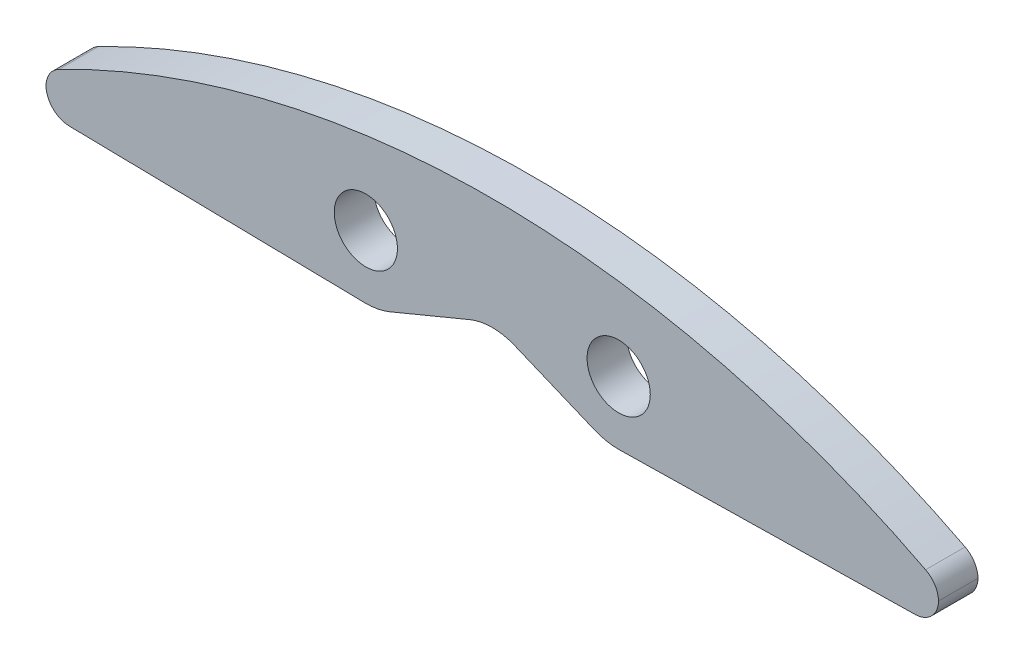
ISO-10303-21;
HEADER;
FILE_DESCRIPTION(('STEP AP214'),'2;1');
FILE_NAME('part.step','',(''),(''),'','','');
FILE_SCHEMA(('AUTOMOTIVE_DESIGN { 1 0 10303 214 1 1 1 1 }'));
ENDSEC;
DATA;
#1=APPLICATION_CONTEXT('core data for automotive mechanical design processes');
#2=APPLICATION_PROTOCOL_DEFINITION('international standard','automotive_design',2000,#1);
#3=PRODUCT_CONTEXT('',#1,'mechanical');
#4=PRODUCT('Part','Part','',(#3));
#5=PRODUCT_RELATED_PRODUCT_CATEGORY('part','',(#4));
#6=PRODUCT_DEFINITION_FORMATION('','',#4);
#7=PRODUCT_DEFINITION_CONTEXT('part definition',#1,'design');
#8=PRODUCT_DEFINITION('design','',#6,#7);
#9=PRODUCT_DEFINITION_SHAPE('','',#8);
#10=(LENGTH_UNIT() NAMED_UNIT(*) SI_UNIT(.MILLI.,.METRE.));
#11=(NAMED_UNIT(*) PLANE_ANGLE_UNIT() SI_UNIT($,.RADIAN.));
#12=(NAMED_UNIT(*) SI_UNIT($,.STERADIAN.) SOLID_ANGLE_UNIT());
#13=UNCERTAINTY_MEASURE_WITH_UNIT(LENGTH_MEASURE(1.E-05),#10,'distance_accuracy_value','');
#14=(GEOMETRIC_REPRESENTATION_CONTEXT(3) GLOBAL_UNCERTAINTY_ASSIGNED_CONTEXT((#13)) GLOBAL_UNIT_ASSIGNED_CONTEXT((#10,
#11,#12)) REPRESENTATION_CONTEXT('',''));
#15=CARTESIAN_POINT('',(0.,0.,0.));
#16=DIRECTION('',(0.,0.,1.));
#17=DIRECTION('',(1.,0.,0.));
#18=AXIS2_PLACEMENT_3D('',#15,#16,#17);
#19=CARTESIAN_POINT('',(-16.,10.,5.));
#20=DIRECTION('',(0.,0.,-1.));
#21=DIRECTION('',(-1.,0.,0.));
#22=AXIS2_PLACEMENT_3D('',#19,#20,#21);
#23=CYLINDRICAL_SURFACE('',#22,8.);
#24=CARTESIAN_POINT('',(-16.,10.,0.));
#25=DIRECTION('',(0.,0.,1.));
#26=DIRECTION('',(1.,0.,0.));
#27=AXIS2_PLACEMENT_3D('',#24,#25,#26);
#28=CIRCLE('',#27,8.);
#29=CARTESIAN_POINT('',(-12.9343268772646,2.61070718508615,0.));
#30=VERTEX_POINT('',#29);
#31=CARTESIAN_POINT('',(-16.1429120912865,2.00127659347042,0.));
#32=VERTEX_POINT('',#31);
#33=EDGE_CURVE('E136',#30,#32,#28,.F.);
#34=ORIENTED_EDGE('',*,*,#33,.F.);
#35=DIRECTION('',(0.,0.,-1.));
#36=VECTOR('',#35,1.);
#37=CARTESIAN_POINT('',(-12.9343268772646,2.61070718508615,5.));
#38=LINE('',#37,#36);
#39=CARTESIAN_POINT('',(-12.9343268772646,2.61070718508615,5.));
#40=VERTEX_POINT('',#39);
#41=EDGE_CURVE('E131',#40,#30,#38,.T.);
#42=ORIENTED_EDGE('',*,*,#41,.F.);
#43=CARTESIAN_POINT('',(-16.,10.,5.));
#44=DIRECTION('',(0.,0.,1.));
#45=DIRECTION('',(1.,0.,0.));
#46=AXIS2_PLACEMENT_3D('',#43,#44,#45);
#47=CIRCLE('',#46,8.);
#48=CARTESIAN_POINT('',(-16.1429120912865,2.00127659347042,5.));
#49=VERTEX_POINT('',#48);
#50=EDGE_CURVE('E133',#40,#49,#47,.F.);
#51=ORIENTED_EDGE('',*,*,#50,.T.);
#52=DIRECTION('',(0.,0.,-1.));
#53=VECTOR('',#52,1.);
#54=CARTESIAN_POINT('',(-16.1429120912865,2.00127659347042,5.));
#55=LINE('',#54,#53);
#56=EDGE_CURVE('E262',#49,#32,#55,.T.);
#57=ORIENTED_EDGE('',*,*,#56,.T.);
#58=EDGE_LOOP('',(#34,#42,#51,#57));
#59=FACE_BOUND('',#58,.T.);
#60=ADVANCED_FACE('F40',(#59),#23,.T.);
#61=CARTESIAN_POINT('',(-2.8234704853026,6.80550382734601,5.));
#62=DIRECTION('',(0.38320914034193,-0.923661601864232,0.));
#63=DIRECTION('',(0.923661601864232,0.38320914034193,0.));
#64=AXIS2_PLACEMENT_3D('',#61,#62,#63);
#65=PLANE('',#64);
#66=DIRECTION('',(-0.923661601864232,-0.38320914034193,0.));
#67=VECTOR('',#66,1.);
#68=CARTESIAN_POINT('',(-2.8234704853026,6.80550382734601,0.));
#69=LINE('',#68,#67);
#70=CARTESIAN_POINT('',(-2.8234704853026,6.80550382734601,0.));
#71=VERTEX_POINT('',#70);
#72=EDGE_CURVE('E203',#71,#30,#69,.T.);
#73=ORIENTED_EDGE('',*,*,#72,.F.);
#74=DIRECTION('',(0.,0.,-1.));
#75=VECTOR('',#74,1.);
#76=CARTESIAN_POINT('',(-2.8234704853026,6.80550382734601,5.));
#77=LINE('',#76,#75);
#78=CARTESIAN_POINT('',(-2.8234704853026,6.80550382734601,5.));
#79=VERTEX_POINT('',#78);
#80=EDGE_CURVE('E142',#79,#71,#77,.T.);
#81=ORIENTED_EDGE('',*,*,#80,.F.);
#82=DIRECTION('',(-0.923661601864232,-0.38320914034193,0.));
#83=VECTOR('',#82,1.);
#84=CARTESIAN_POINT('',(-2.8234704853026,6.80550382734601,5.));
#85=LINE('',#84,#83);
#86=EDGE_CURVE('E148',#79,#40,#85,.T.);
#87=ORIENTED_EDGE('',*,*,#86,.T.);
#88=ORIENTED_EDGE('',*,*,#41,.T.);
#89=EDGE_LOOP('',(#73,#81,#87,#88));
#90=FACE_BOUND('',#89,.T.);
#91=ADVANCED_FACE('F155',(#90),#65,.T.);
#92=CARTESIAN_POINT('',(0.,0.,5.));
#93=DIRECTION('',(0.,0.,-1.));
#94=DIRECTION('',(-1.,0.,0.));
#95=AXIS2_PLACEMENT_3D('',#92,#93,#94);
#96=CYLINDRICAL_SURFACE('',#95,7.3679622641132);
#97=CARTESIAN_POINT('',(0.,0.,0.));
#98=DIRECTION('',(0.,0.,1.));
#99=DIRECTION('',(1.,0.,0.));
#100=AXIS2_PLACEMENT_3D('',#97,#98,#99);
#101=CIRCLE('',#100,7.3679622641132);
#102=CARTESIAN_POINT('',(2.8234704853026,6.80550382734601,0.));
#103=VERTEX_POINT('',#102);
#104=EDGE_CURVE('E276',#103,#71,#101,.T.);
#105=ORIENTED_EDGE('',*,*,#104,.F.);
#106=DIRECTION('',(0.,0.,-1.));
#107=VECTOR('',#106,1.);
#108=CARTESIAN_POINT('',(2.8234704853026,6.80550382734601,5.));
#109=LINE('',#108,#107);
#110=CARTESIAN_POINT('',(2.8234704853026,6.80550382734601,5.));
#111=VERTEX_POINT('',#110);
#112=EDGE_CURVE('E271',#111,#103,#109,.T.);
#113=ORIENTED_EDGE('',*,*,#112,.F.);
#114=CARTESIAN_POINT('',(0.,0.,5.));
#115=DIRECTION('',(0.,0.,1.));
#116=DIRECTION('',(1.,0.,0.));
#117=AXIS2_PLACEMENT_3D('',#114,#115,#116);
#118=CIRCLE('',#117,7.3679622641132);
#119=EDGE_CURVE('E157',#111,#79,#118,.T.);
#120=ORIENTED_EDGE('',*,*,#119,.T.);
#121=ORIENTED_EDGE('',*,*,#80,.T.);
#122=EDGE_LOOP('',(#105,#113,#120,#121));
#123=FACE_BOUND('',#122,.T.);
#124=ADVANCED_FACE('F274',(#123),#96,.F.);
#125=CARTESIAN_POINT('',(2.8234704853026,6.80550382734601,5.));
#126=DIRECTION('',(0.38320914034193,0.923661601864232,0.));
#127=DIRECTION('',(-0.923661601864232,0.38320914034193,0.));
#128=AXIS2_PLACEMENT_3D('',#125,#126,#127);
#129=PLANE('',#128);
#130=DIRECTION('',(0.923661601864232,-0.38320914034193,0.));
#131=VECTOR('',#130,1.);
#132=CARTESIAN_POINT('',(2.8234704853026,6.80550382734601,0.));
#133=LINE('',#132,#131);
#134=CARTESIAN_POINT('',(12.9343268772646,2.61070718508615,0.));
#135=VERTEX_POINT('',#134);
#136=EDGE_CURVE('E280',#103,#135,#133,.T.);
#137=ORIENTED_EDGE('',*,*,#136,.T.);
#138=DIRECTION('',(0.,0.,-1.));
#139=VECTOR('',#138,1.);
#140=CARTESIAN_POINT('',(12.9343268772646,2.61070718508615,5.));
#141=LINE('',#140,#139);
#142=CARTESIAN_POINT('',(12.9343268772646,2.61070718508615,5.));
#143=VERTEX_POINT('',#142);
#144=EDGE_CURVE('E268',#143,#135,#141,.T.);
#145=ORIENTED_EDGE('',*,*,#144,.F.);
#146=DIRECTION('',(0.923661601864232,-0.38320914034193,0.));
#147=VECTOR('',#146,1.);
#148=CARTESIAN_POINT('',(2.8234704853026,6.80550382734601,5.));
#149=LINE('',#148,#147);
#150=EDGE_CURVE('E160',#111,#143,#149,.T.);
#151=ORIENTED_EDGE('',*,*,#150,.F.);
#152=ORIENTED_EDGE('',*,*,#112,.T.);
#153=EDGE_LOOP('',(#137,#145,#151,#152));
#154=FACE_BOUND('',#153,.T.);
#155=ADVANCED_FACE('F294',(#154),#129,.F.);
#156=CARTESIAN_POINT('',(16.,10.,5.));
#157=DIRECTION('',(0.,0.,-1.));
#158=DIRECTION('',(-1.,0.,0.));
#159=AXIS2_PLACEMENT_3D('',#156,#157,#158);
#160=CYLINDRICAL_SURFACE('',#159,8.);
#161=CARTESIAN_POINT('',(16.,10.,0.));
#162=DIRECTION('',(0.,0.,1.));
#163=DIRECTION('',(1.,0.,0.));
#164=AXIS2_PLACEMENT_3D('',#161,#162,#163);
#165=CIRCLE('',#164,8.);
#166=CARTESIAN_POINT('',(16.1429120912865,2.00127659347042,0.));
#167=VERTEX_POINT('',#166);
#168=EDGE_CURVE('E254',#135,#167,#165,.T.);
#169=ORIENTED_EDGE('',*,*,#168,.T.);
#170=DIRECTION('',(0.,0.,-1.));
#171=VECTOR('',#170,1.);
#172=CARTESIAN_POINT('',(16.1429120912865,2.00127659347042,5.));
#173=LINE('',#172,#171);
#174=CARTESIAN_POINT('',(16.1429120912865,2.00127659347042,5.));
#175=VERTEX_POINT('',#174);
#176=EDGE_CURVE('E264',#175,#167,#173,.T.);
#177=ORIENTED_EDGE('',*,*,#176,.F.);
#178=CARTESIAN_POINT('',(16.,10.,5.));
#179=DIRECTION('',(0.,0.,1.));
#180=DIRECTION('',(1.,0.,0.));
#181=AXIS2_PLACEMENT_3D('',#178,#179,#180);
#182=CIRCLE('',#181,8.);
#183=EDGE_CURVE('E175',#143,#175,#182,.T.);
#184=ORIENTED_EDGE('',*,*,#183,.F.);
#185=ORIENTED_EDGE('',*,*,#144,.T.);
#186=EDGE_LOOP('',(#169,#177,#184,#185));
#187=FACE_BOUND('',#186,.T.);
#188=ADVANCED_FACE('F285',(#187),#160,.T.);
#189=CARTESIAN_POINT('',(-0.0305935500122583,1.71230679202113,5.));
#190=DIRECTION('',(-0.0178640114108172,0.999840425816197,0.));
#191=DIRECTION('',(-0.999840425816197,-0.0178640114108172,0.));
#192=AXIS2_PLACEMENT_3D('',#189,#190,#191);
#193=PLANE('',#192);
#194=DIRECTION('',(0.999840425816197,0.0178640114108172,0.));
#195=VECTOR('',#194,1.);
#196=CARTESIAN_POINT('',(-0.0305935500122583,1.71230679202113,0.));
#197=LINE('',#196,#195);
#198=CARTESIAN_POINT('',(53.5323481717195,2.66930850690264,0.));
#199=VERTEX_POINT('',#198);
#200=EDGE_CURVE('E249',#167,#199,#197,.T.);
#201=ORIENTED_EDGE('',*,*,#200,.T.);
#202=DIRECTION('',(0.,0.,-1.));
#203=VECTOR('',#202,1.);
#204=CARTESIAN_POINT('',(53.5323481717195,2.66930850690264,5.));
#205=LINE('',#204,#203);
#206=CARTESIAN_POINT('',(53.5323481717195,2.66930850690264,5.));
#207=VERTEX_POINT('',#206);
#208=EDGE_CURVE('E226',#199,#207,#205,.F.);
#209=ORIENTED_EDGE('',*,*,#208,.T.);
#210=DIRECTION('',(0.999840425816197,0.0178640114108172,0.));
#211=VECTOR('',#210,1.);
#212=CARTESIAN_POINT('',(-0.0305935500122583,1.71230679202113,5.));
#213=LINE('',#212,#211);
#214=EDGE_CURVE('E179',#175,#207,#213,.T.);
#215=ORIENTED_EDGE('',*,*,#214,.F.);
#216=ORIENTED_EDGE('',*,*,#176,.T.);
#217=EDGE_LOOP('',(#201,#209,#215,#216));
#218=FACE_BOUND('',#217,.T.);
#219=ADVANCED_FACE('F290',(#218),#193,.F.);
#220=CARTESIAN_POINT('',(0.,-98.5,5.));
#221=DIRECTION('',(0.,0.,-1.));
#222=DIRECTION('',(-1.,0.,0.));
#223=AXIS2_PLACEMENT_3D('',#220,#221,#222);
#224=CYLINDRICAL_SURFACE('',#223,120.);
#225=CARTESIAN_POINT('',(0.,-98.5,5.));
#226=DIRECTION('',(0.,0.,1.));
#227=DIRECTION('',(1.,0.,0.));
#228=AXIS2_PLACEMENT_3D('',#225,#226,#227);
#229=CIRCLE('',#228,120.);
#230=CARTESIAN_POINT('',(-54.8500062948586,8.2308615605345,5.));
#231=VERTEX_POINT('',#230);
#232=CARTESIAN_POINT('',(54.8500062948586,8.2308615605345,5.));
#233=VERTEX_POINT('',#232);
#234=EDGE_CURVE('E183',#231,#233,#229,.F.);
#235=ORIENTED_EDGE('',*,*,#234,.T.);
#236=DIRECTION('',(0.,0.,-1.));
#237=VECTOR('',#236,1.);
#238=CARTESIAN_POINT('',(54.8500062948586,8.2308615605345,5.));
#239=LINE('',#238,#237);
#240=CARTESIAN_POINT('',(54.8500062948586,8.2308615605345,0.));
#241=VERTEX_POINT('',#240);
#242=EDGE_CURVE('E49',#233,#241,#239,.T.);
#243=ORIENTED_EDGE('',*,*,#242,.T.);
#244=CARTESIAN_POINT('',(0.,-98.5,0.));
#245=DIRECTION('',(0.,0.,1.));
#246=DIRECTION('',(1.,0.,0.));
#247=AXIS2_PLACEMENT_3D('',#244,#245,#246);
#248=CIRCLE('',#247,120.);
#249=CARTESIAN_POINT('',(-54.8500062948586,8.2308615605345,0.));
#250=VERTEX_POINT('',#249);
#251=EDGE_CURVE('E247',#250,#241,#248,.F.);
#252=ORIENTED_EDGE('',*,*,#251,.F.);
#253=DIRECTION('',(0.,0.,-1.));
#254=VECTOR('',#253,1.);
#255=CARTESIAN_POINT('',(-54.8500062948586,8.2308615605345,5.));
#256=LINE('',#255,#254);
#257=EDGE_CURVE('E193',#250,#231,#256,.F.);
#258=ORIENTED_EDGE('',*,*,#257,.T.);
#259=EDGE_LOOP('',(#235,#243,#252,#258));
#260=FACE_BOUND('',#259,.T.);
#261=ADVANCED_FACE('F240',(#260),#224,.T.);
#262=CARTESIAN_POINT('',(-16.,10.,5.));
#263=DIRECTION('',(0.,0.,-1.));
#264=DIRECTION('',(-1.,0.,0.));
#265=AXIS2_PLACEMENT_3D('',#262,#263,#264);
#266=CYLINDRICAL_SURFACE('',#265,4.);
#267=CARTESIAN_POINT('',(-16.,10.,5.));
#268=DIRECTION('',(0.,0.,1.));
#269=DIRECTION('',(1.,0.,0.));
#270=AXIS2_PLACEMENT_3D('',#267,#268,#269);
#271=CIRCLE('',#270,4.);
#272=CARTESIAN_POINT('',(-12.,10.,5.));
#273=VERTEX_POINT('',#272);
#274=EDGE_CURVE('E431',#273,#273,#271,.T.);
#275=ORIENTED_EDGE('',*,*,#274,.T.);
#276=EDGE_LOOP('',(#275));
#277=FACE_BOUND('',#276,.T.);
#278=CARTESIAN_POINT('',(-16.,10.,0.));
#279=DIRECTION('',(0.,0.,1.));
#280=DIRECTION('',(1.,0.,0.));
#281=AXIS2_PLACEMENT_3D('',#278,#279,#280);
#282=CIRCLE('',#281,4.);
#283=CARTESIAN_POINT('',(-12.,10.,0.));
#284=VERTEX_POINT('',#283);
#285=EDGE_CURVE('E252',#284,#284,#282,.T.);
#286=ORIENTED_EDGE('',*,*,#285,.F.);
#287=EDGE_LOOP('',(#286));
#288=FACE_BOUND('',#287,.T.);
#289=ADVANCED_FACE('F357',(#277,#288),#266,.F.);
#290=CARTESIAN_POINT('',(0.0305935500122583,1.71230679202113,5.));
#291=DIRECTION('',(-0.0178640114108172,-0.999840425816197,0.));
#292=DIRECTION('',(0.999840425816197,-0.0178640114108172,0.));
#293=AXIS2_PLACEMENT_3D('',#290,#291,#292);
#294=PLANE('',#293);
#295=DIRECTION('',(-0.999840425816197,0.0178640114108172,0.));
#296=VECTOR('',#295,1.);
#297=CARTESIAN_POINT('',(0.0305935500122583,1.71230679202113,5.));
#298=LINE('',#297,#296);
#299=CARTESIAN_POINT('',(-53.5323481717195,2.66930850690264,5.));
#300=VERTEX_POINT('',#299);
#301=EDGE_CURVE('E151',#49,#300,#298,.T.);
#302=ORIENTED_EDGE('',*,*,#301,.T.);
#303=DIRECTION('',(0.,0.,-1.));
#304=VECTOR('',#303,1.);
#305=CARTESIAN_POINT('',(-53.5323481717195,2.66930850690264,0.));
#306=LINE('',#305,#304);
#307=CARTESIAN_POINT('',(-53.5323481717195,2.66930850690264,0.));
#308=VERTEX_POINT('',#307);
#309=EDGE_CURVE('E12',#300,#308,#306,.T.);
#310=ORIENTED_EDGE('',*,*,#309,.T.);
#311=DIRECTION('',(-0.999840425816197,0.0178640114108172,0.));
#312=VECTOR('',#311,1.);
#313=CARTESIAN_POINT('',(0.0305935500122583,1.71230679202113,0.));
#314=LINE('',#313,#312);
#315=EDGE_CURVE('E248',#32,#308,#314,.T.);
#316=ORIENTED_EDGE('',*,*,#315,.F.);
#317=ORIENTED_EDGE('',*,*,#56,.F.);
#318=EDGE_LOOP('',(#302,#310,#316,#317));
#319=FACE_BOUND('',#318,.T.);
#320=ADVANCED_FACE('F348',(#319),#294,.T.);
#321=CARTESIAN_POINT('',(16.,10.,5.));
#322=DIRECTION('',(0.,0.,-1.));
#323=DIRECTION('',(-1.,0.,0.));
#324=AXIS2_PLACEMENT_3D('',#321,#322,#323);
#325=CYLINDRICAL_SURFACE('',#324,4.);
#326=CARTESIAN_POINT('',(16.,10.,5.));
#327=DIRECTION('',(0.,0.,1.));
#328=DIRECTION('',(1.,0.,0.));
#329=AXIS2_PLACEMENT_3D('',#326,#327,#328);
#330=CIRCLE('',#329,4.);
#331=CARTESIAN_POINT('',(20.,10.,5.));
#332=VERTEX_POINT('',#331);
#333=EDGE_CURVE('E265',#332,#332,#330,.T.);
#334=ORIENTED_EDGE('',*,*,#333,.T.);
#335=EDGE_LOOP('',(#334));
#336=FACE_BOUND('',#335,.T.);
#337=CARTESIAN_POINT('',(16.,10.,0.));
#338=DIRECTION('',(0.,0.,1.));
#339=DIRECTION('',(1.,0.,0.));
#340=AXIS2_PLACEMENT_3D('',#337,#338,#339);
#341=CIRCLE('',#340,4.);
#342=CARTESIAN_POINT('',(20.,10.,0.));
#343=VERTEX_POINT('',#342);
#344=EDGE_CURVE('E153',#343,#343,#341,.T.);
#345=ORIENTED_EDGE('',*,*,#344,.F.);
#346=EDGE_LOOP('',(#345));
#347=FACE_BOUND('',#346,.T.);
#348=ADVANCED_FACE('F340',(#336,#347),#325,.F.);
#349=CARTESIAN_POINT('',(0.,0.,5.));
#350=DIRECTION('',(0.,0.,1.));
#351=DIRECTION('',(1.,0.,0.));
#352=AXIS2_PLACEMENT_3D('',#349,#350,#351);
#353=PLANE('',#352);
#354=ORIENTED_EDGE('',*,*,#214,.T.);
#355=CARTESIAN_POINT('',(53.4787561374871,5.66882978435123,5.));
#356=DIRECTION('',(0.,0.,1.));
#357=DIRECTION('',(1.,0.,0.));
#358=AXIS2_PLACEMENT_3D('',#355,#356,#357);
#359=CIRCLE('',#358,3.);
#360=CARTESIAN_POINT('',(56.4782858136528,5.61570990293619,5.));
#361=VERTEX_POINT('',#360);
#362=EDGE_CURVE('E57',#207,#361,#359,.T.);
#363=ORIENTED_EDGE('',*,*,#362,.T.);
#364=CARTESIAN_POINT('',(53.4787561374871,5.56259002152114,5.));
#365=DIRECTION('',(0.,0.,1.));
#366=DIRECTION('',(1.,0.,0.));
#367=AXIS2_PLACEMENT_3D('',#364,#365,#366);
#368=CIRCLE('',#367,3.);
#369=EDGE_CURVE('E194',#361,#233,#368,.T.);
#370=ORIENTED_EDGE('',*,*,#369,.T.);
#371=ORIENTED_EDGE('',*,*,#234,.F.);
#372=CARTESIAN_POINT('',(-53.4787561374871,5.56259002152114,5.));
#373=DIRECTION('',(0.,0.,1.));
#374=DIRECTION('',(1.,0.,0.));
#375=AXIS2_PLACEMENT_3D('',#372,#373,#374);
#376=CIRCLE('',#375,3.);
#377=CARTESIAN_POINT('',(-56.4782858136528,5.61570990293619,5.));
#378=VERTEX_POINT('',#377);
#379=EDGE_CURVE('E64',#231,#378,#376,.T.);
#380=ORIENTED_EDGE('',*,*,#379,.T.);
#381=CARTESIAN_POINT('',(-53.4787561374871,5.66882978435123,5.));
#382=DIRECTION('',(0.,0.,1.));
#383=DIRECTION('',(1.,0.,0.));
#384=AXIS2_PLACEMENT_3D('',#381,#382,#383);
#385=CIRCLE('',#384,3.);
#386=EDGE_CURVE('E211',#378,#300,#385,.T.);
#387=ORIENTED_EDGE('',*,*,#386,.T.);
#388=ORIENTED_EDGE('',*,*,#301,.F.);
#389=ORIENTED_EDGE('',*,*,#50,.F.);
#390=ORIENTED_EDGE('',*,*,#86,.F.);
#391=ORIENTED_EDGE('',*,*,#119,.F.);
#392=ORIENTED_EDGE('',*,*,#150,.T.);
#393=ORIENTED_EDGE('',*,*,#183,.T.);
#394=EDGE_LOOP('',(#354,#363,#370,#371,#380,#387,#388,#389,#390,#391,#392,#393));
#395=FACE_BOUND('',#394,.T.);
#396=ORIENTED_EDGE('',*,*,#274,.F.);
#397=EDGE_LOOP('',(#396));
#398=FACE_BOUND('',#397,.T.);
#399=ORIENTED_EDGE('',*,*,#333,.F.);
#400=EDGE_LOOP('',(#399));
#401=FACE_BOUND('',#400,.T.);
#402=ADVANCED_FACE('F145',(#395,#398,#401),#353,.T.);
#403=CARTESIAN_POINT('',(0.,0.,0.));
#404=DIRECTION('',(0.,0.,1.));
#405=DIRECTION('',(1.,0.,0.));
#406=AXIS2_PLACEMENT_3D('',#403,#404,#405);
#407=PLANE('',#406);
#408=CARTESIAN_POINT('',(53.4787561374871,5.56259002152114,0.));
#409=DIRECTION('',(0.,0.,1.));
#410=DIRECTION('',(1.,0.,0.));
#411=AXIS2_PLACEMENT_3D('',#408,#409,#410);
#412=CIRCLE('',#411,3.);
#413=CARTESIAN_POINT('',(56.4782858136528,5.61570990293619,0.));
#414=VERTEX_POINT('',#413);
#415=EDGE_CURVE('E219',#241,#414,#412,.F.);
#416=ORIENTED_EDGE('',*,*,#415,.T.);
#417=CARTESIAN_POINT('',(53.4787561374871,5.66882978435123,0.));
#418=DIRECTION('',(0.,0.,1.));
#419=DIRECTION('',(1.,0.,0.));
#420=AXIS2_PLACEMENT_3D('',#417,#418,#419);
#421=CIRCLE('',#420,3.);
#422=EDGE_CURVE('E224',#414,#199,#421,.F.);
#423=ORIENTED_EDGE('',*,*,#422,.T.);
#424=ORIENTED_EDGE('',*,*,#200,.F.);
#425=ORIENTED_EDGE('',*,*,#168,.F.);
#426=ORIENTED_EDGE('',*,*,#136,.F.);
#427=ORIENTED_EDGE('',*,*,#104,.T.);
#428=ORIENTED_EDGE('',*,*,#72,.T.);
#429=ORIENTED_EDGE('',*,*,#33,.T.);
#430=ORIENTED_EDGE('',*,*,#315,.T.);
#431=CARTESIAN_POINT('',(-53.4787561374871,5.66882978435123,0.));
#432=DIRECTION('',(0.,0.,1.));
#433=DIRECTION('',(1.,0.,0.));
#434=AXIS2_PLACEMENT_3D('',#431,#432,#433);
#435=CIRCLE('',#434,3.);
#436=CARTESIAN_POINT('',(-56.4782858136528,5.61570990293619,0.));
#437=VERTEX_POINT('',#436);
#438=EDGE_CURVE('E210',#308,#437,#435,.F.);
#439=ORIENTED_EDGE('',*,*,#438,.T.);
#440=CARTESIAN_POINT('',(-53.4787561374871,5.56259002152114,0.));
#441=DIRECTION('',(0.,0.,1.));
#442=DIRECTION('',(1.,0.,0.));
#443=AXIS2_PLACEMENT_3D('',#440,#441,#442);
#444=CIRCLE('',#443,3.);
#445=EDGE_CURVE('E141',#437,#250,#444,.F.);
#446=ORIENTED_EDGE('',*,*,#445,.T.);
#447=ORIENTED_EDGE('',*,*,#251,.T.);
#448=EDGE_LOOP('',(#416,#423,#424,#425,#426,#427,#428,#429,#430,#439,#446,#447));
#449=FACE_BOUND('',#448,.T.);
#450=ORIENTED_EDGE('',*,*,#285,.T.);
#451=EDGE_LOOP('',(#450));
#452=FACE_BOUND('',#451,.T.);
#453=ORIENTED_EDGE('',*,*,#344,.T.);
#454=EDGE_LOOP('',(#453));
#455=FACE_BOUND('',#454,.T.);
#456=ADVANCED_FACE('F243',(#449,#452,#455),#407,.F.);
#457=CARTESIAN_POINT('',(53.4787561374871,5.56259002152114,5.));
#458=DIRECTION('',(0.,0.,-1.));
#459=DIRECTION('',(-1.,0.,0.));
#460=AXIS2_PLACEMENT_3D('',#457,#458,#459);
#461=CYLINDRICAL_SURFACE('',#460,3.);
#462=ORIENTED_EDGE('',*,*,#242,.F.);
#463=ORIENTED_EDGE('',*,*,#369,.F.);
#464=DIRECTION('',(0.,0.,-1.));
#465=VECTOR('',#464,1.);
#466=CARTESIAN_POINT('',(56.4782858136528,5.61570990293619,2.5));
#467=LINE('',#466,#465);
#468=EDGE_CURVE('E198',#414,#361,#467,.F.);
#469=ORIENTED_EDGE('',*,*,#468,.F.);
#470=ORIENTED_EDGE('',*,*,#415,.F.);
#471=EDGE_LOOP('',(#462,#463,#469,#470));
#472=FACE_BOUND('',#471,.T.);
#473=ADVANCED_FACE('F242',(#472),#461,.T.);
#474=CARTESIAN_POINT('',(53.4787561374871,5.66882978435123,5.));
#475=DIRECTION('',(0.,0.,1.));
#476=DIRECTION('',(1.,0.,0.));
#477=AXIS2_PLACEMENT_3D('',#474,#475,#476);
#478=CYLINDRICAL_SURFACE('',#477,3.);
#479=ORIENTED_EDGE('',*,*,#362,.F.);
#480=ORIENTED_EDGE('',*,*,#208,.F.);
#481=ORIENTED_EDGE('',*,*,#422,.F.);
#482=ORIENTED_EDGE('',*,*,#468,.T.);
#483=EDGE_LOOP('',(#479,#480,#481,#482));
#484=FACE_BOUND('',#483,.T.);
#485=ADVANCED_FACE('F310',(#484),#478,.T.);
#486=CARTESIAN_POINT('',(-53.4787561374871,5.56259002152114,5.));
#487=DIRECTION('',(0.,0.,-1.));
#488=DIRECTION('',(-1.,0.,0.));
#489=AXIS2_PLACEMENT_3D('',#486,#487,#488);
#490=CYLINDRICAL_SURFACE('',#489,3.);
#491=DIRECTION('',(0.,0.,-1.));
#492=VECTOR('',#491,1.);
#493=CARTESIAN_POINT('',(-56.4782858136528,5.61570990293619,2.5));
#494=LINE('',#493,#492);
#495=EDGE_CURVE('E44',#378,#437,#494,.T.);
#496=ORIENTED_EDGE('',*,*,#495,.F.);
#497=ORIENTED_EDGE('',*,*,#379,.F.);
#498=ORIENTED_EDGE('',*,*,#257,.F.);
#499=ORIENTED_EDGE('',*,*,#445,.F.);
#500=EDGE_LOOP('',(#496,#497,#498,#499));
#501=FACE_BOUND('',#500,.T.);
#502=ADVANCED_FACE('F42',(#501),#490,.T.);
#503=CARTESIAN_POINT('',(-53.4787561374871,5.66882978435123,5.));
#504=DIRECTION('',(0.,0.,1.));
#505=DIRECTION('',(1.,0.,0.));
#506=AXIS2_PLACEMENT_3D('',#503,#504,#505);
#507=CYLINDRICAL_SURFACE('',#506,3.);
#508=ORIENTED_EDGE('',*,*,#386,.F.);
#509=ORIENTED_EDGE('',*,*,#495,.T.);
#510=ORIENTED_EDGE('',*,*,#438,.F.);
#511=ORIENTED_EDGE('',*,*,#309,.F.);
#512=EDGE_LOOP('',(#508,#509,#510,#511));
#513=FACE_BOUND('',#512,.T.);
#514=ADVANCED_FACE('F208',(#513),#507,.T.);
#515=CLOSED_SHELL('',(#60,#91,#124,#155,#188,#219,#261,#289,#320,#348,#402,#456,#473,#485,#502,#514));
#516=MANIFOLD_SOLID_BREP('B2',#515);
#517=ADVANCED_BREP_SHAPE_REPRESENTATION('',(#18,#516),#14);
#518=SHAPE_DEFINITION_REPRESENTATION(#9,#517);
ENDSEC;
END-ISO-10303-21;
